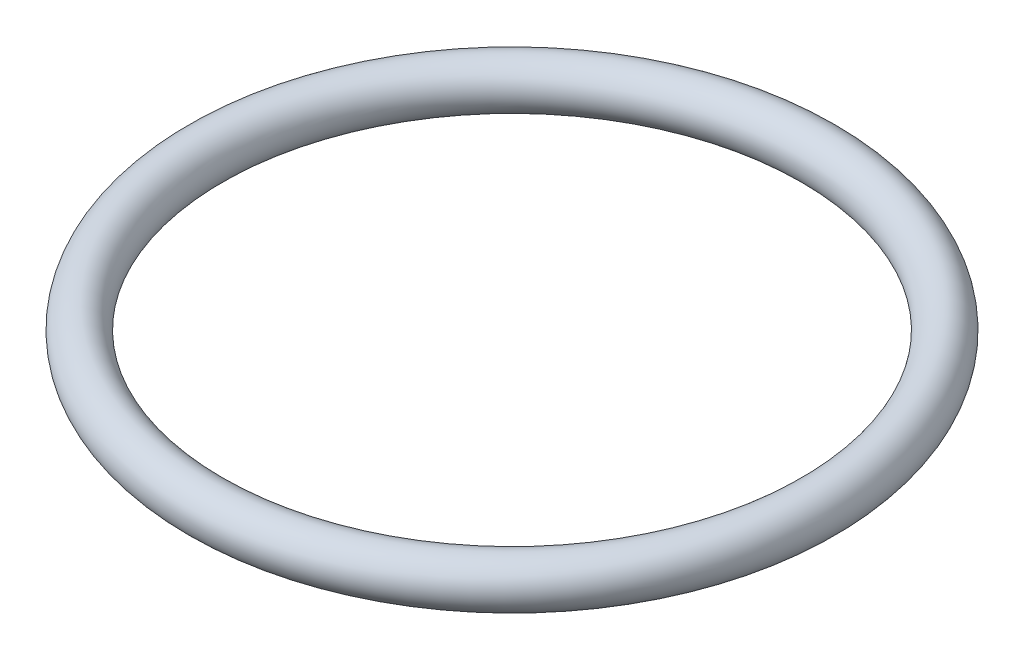
ISO-10303-21;
HEADER;
FILE_DESCRIPTION(('STEP AP214'),'2;1');
FILE_NAME('part.step','',(''),(''),'','','');
FILE_SCHEMA(('AUTOMOTIVE_DESIGN { 1 0 10303 214 1 1 1 1 }'));
ENDSEC;
DATA;
#1=APPLICATION_CONTEXT('core data for automotive mechanical design processes');
#2=APPLICATION_PROTOCOL_DEFINITION('international standard','automotive_design',2000,#1);
#3=PRODUCT_CONTEXT('',#1,'mechanical');
#4=PRODUCT('Part','Part','',(#3));
#5=PRODUCT_RELATED_PRODUCT_CATEGORY('part','',(#4));
#6=PRODUCT_DEFINITION_FORMATION('','',#4);
#7=PRODUCT_DEFINITION_CONTEXT('part definition',#1,'design');
#8=PRODUCT_DEFINITION('design','',#6,#7);
#9=PRODUCT_DEFINITION_SHAPE('','',#8);
#10=(LENGTH_UNIT() NAMED_UNIT(*) SI_UNIT(.MILLI.,.METRE.));
#11=(NAMED_UNIT(*) PLANE_ANGLE_UNIT() SI_UNIT($,.RADIAN.));
#12=(NAMED_UNIT(*) SI_UNIT($,.STERADIAN.) SOLID_ANGLE_UNIT());
#13=UNCERTAINTY_MEASURE_WITH_UNIT(LENGTH_MEASURE(1.E-05),#10,'distance_accuracy_value','');
#14=(GEOMETRIC_REPRESENTATION_CONTEXT(3) GLOBAL_UNCERTAINTY_ASSIGNED_CONTEXT((#13)) GLOBAL_UNIT_ASSIGNED_CONTEXT((#10,
#11,#12)) REPRESENTATION_CONTEXT('',''));
#15=CARTESIAN_POINT('',(0.,0.,0.));
#16=DIRECTION('',(0.,0.,1.));
#17=DIRECTION('',(1.,0.,0.));
#18=AXIS2_PLACEMENT_3D('',#15,#16,#17);
#19=CARTESIAN_POINT('',(0.,0.,0.));
#20=DIRECTION('',(0.,-1.,0.));
#21=DIRECTION('',(0.,0.,-1.));
#22=AXIS2_PLACEMENT_3D('',#19,#20,#21);
#23=TOROIDAL_SURFACE('',#22,13.,1.);
#24=CARTESIAN_POINT('',(0.,0.,-14.));
#25=VERTEX_POINT('',#24);
#26=VERTEX_LOOP('',#25);
#27=FACE_BOUND('',#26,.T.);
#28=ADVANCED_FACE('F29',(#27),#23,.T.);
#29=CLOSED_SHELL('',(#28));
#30=MANIFOLD_SOLID_BREP('B2',#29);
#31=ADVANCED_BREP_SHAPE_REPRESENTATION('',(#18,#30),#14);
#32=SHAPE_DEFINITION_REPRESENTATION(#9,#31);
ENDSEC;
END-ISO-10303-21;
